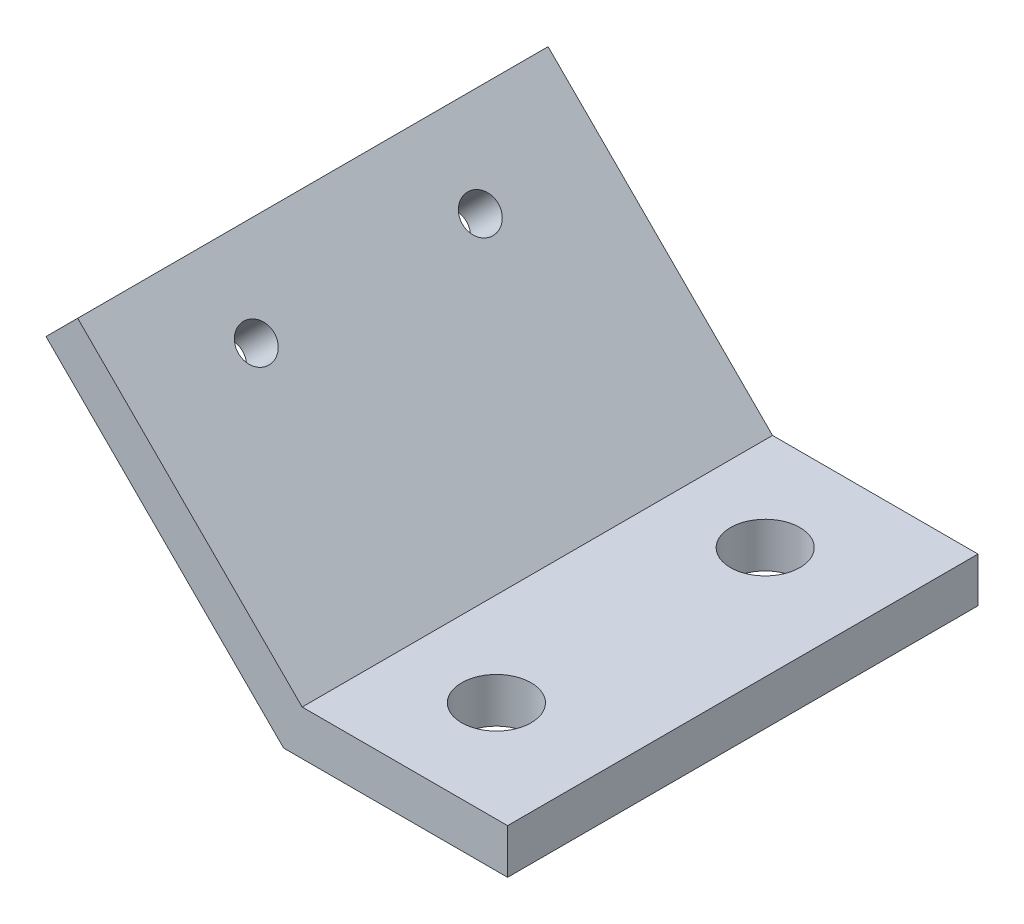
ISO-10303-21;
HEADER;
FILE_DESCRIPTION(('STEP AP214'),'2;1');
FILE_NAME('part.step','',(''),(''),'','','');
FILE_SCHEMA(('AUTOMOTIVE_DESIGN { 1 0 10303 214 1 1 1 1 }'));
ENDSEC;
DATA;
#1=APPLICATION_CONTEXT('core data for automotive mechanical design processes');
#2=APPLICATION_PROTOCOL_DEFINITION('international standard','automotive_design',2000,#1);
#3=PRODUCT_CONTEXT('',#1,'mechanical');
#4=PRODUCT('Part','Part','',(#3));
#5=PRODUCT_RELATED_PRODUCT_CATEGORY('part','',(#4));
#6=PRODUCT_DEFINITION_FORMATION('','',#4);
#7=PRODUCT_DEFINITION_CONTEXT('part definition',#1,'design');
#8=PRODUCT_DEFINITION('design','',#6,#7);
#9=PRODUCT_DEFINITION_SHAPE('','',#8);
#10=(LENGTH_UNIT() NAMED_UNIT(*) SI_UNIT(.MILLI.,.METRE.));
#11=(NAMED_UNIT(*) PLANE_ANGLE_UNIT() SI_UNIT($,.RADIAN.));
#12=(NAMED_UNIT(*) SI_UNIT($,.STERADIAN.) SOLID_ANGLE_UNIT());
#13=UNCERTAINTY_MEASURE_WITH_UNIT(LENGTH_MEASURE(1.E-05),#10,'distance_accuracy_value','');
#14=(GEOMETRIC_REPRESENTATION_CONTEXT(3) GLOBAL_UNCERTAINTY_ASSIGNED_CONTEXT((#13)) GLOBAL_UNIT_ASSIGNED_CONTEXT((#10,
#11,#12)) REPRESENTATION_CONTEXT('',''));
#15=CARTESIAN_POINT('',(0.,0.,0.));
#16=DIRECTION('',(0.,0.,1.));
#17=DIRECTION('',(1.,0.,0.));
#18=AXIS2_PLACEMENT_3D('',#15,#16,#17);
#19=CARTESIAN_POINT('',(-46.2281728654274,-2.48301663869148,42.));
#20=DIRECTION('',(-0.707106781186555,-0.70710678118654,0.));
#21=DIRECTION('',(0.70710678118654,-0.707106781186555,0.));
#22=AXIS2_PLACEMENT_3D('',#19,#20,#21);
#23=PLANE('',#22);
#24=CARTESIAN_POINT('',(-41.2784253971217,-7.43276410699737,11.));
#25=DIRECTION('',(-0.707106781186555,-0.70710678118654,0.));
#26=DIRECTION('',(0.70710678118654,-0.707106781186555,0.));
#27=AXIS2_PLACEMENT_3D('',#24,#25,#26);
#28=CIRCLE('',#27,1.6);
#29=CARTESIAN_POINT('',(-40.1470545472232,-8.56413495689586,11.));
#30=VERTEX_POINT('',#29);
#31=EDGE_CURVE('E147',#30,#30,#28,.T.);
#32=ORIENTED_EDGE('',*,*,#31,.T.);
#33=EDGE_LOOP('',(#32));
#34=FACE_BOUND('',#33,.T.);
#35=CARTESIAN_POINT('',(-41.2784253971217,-7.43276410699737,31.));
#36=DIRECTION('',(-0.707106781186555,-0.70710678118654,0.));
#37=DIRECTION('',(0.70710678118654,-0.707106781186555,0.));
#38=AXIS2_PLACEMENT_3D('',#35,#36,#37);
#39=CIRCLE('',#38,1.6);
#40=CARTESIAN_POINT('',(-40.1470545472232,-8.56413495689586,31.));
#41=VERTEX_POINT('',#40);
#42=EDGE_CURVE('E175',#41,#41,#39,.T.);
#43=ORIENTED_EDGE('',*,*,#42,.T.);
#44=EDGE_LOOP('',(#43));
#45=FACE_BOUND('',#44,.T.);
#46=DIRECTION('',(-0.70710678118654,0.707106781186555,0.));
#47=VECTOR('',#46,1.);
#48=CARTESIAN_POINT('',(-46.2281728654274,-2.48301663869148,0.));
#49=LINE('',#48,#47);
#50=CARTESIAN_POINT('',(-26.1865423050851,-22.5246471990343,0.));
#51=VERTEX_POINT('',#50);
#52=CARTESIAN_POINT('',(-46.2281728654274,-2.48301663869148,0.));
#53=VERTEX_POINT('',#52);
#54=EDGE_CURVE('E142',#51,#53,#49,.T.);
#55=ORIENTED_EDGE('',*,*,#54,.T.);
#56=DIRECTION('',(0.,0.,-1.));
#57=VECTOR('',#56,1.);
#58=CARTESIAN_POINT('',(-46.2281728654274,-2.48301663869148,42.));
#59=LINE('',#58,#57);
#60=CARTESIAN_POINT('',(-46.2281728654274,-2.48301663869148,42.));
#61=VERTEX_POINT('',#60);
#62=EDGE_CURVE('E12',#61,#53,#59,.T.);
#63=ORIENTED_EDGE('',*,*,#62,.F.);
#64=DIRECTION('',(-0.70710678118654,0.707106781186555,0.));
#65=VECTOR('',#64,1.);
#66=CARTESIAN_POINT('',(-46.2281728654274,-2.48301663869148,42.));
#67=LINE('',#66,#65);
#68=CARTESIAN_POINT('',(-26.1865423050851,-22.5246471990343,42.));
#69=VERTEX_POINT('',#68);
#70=EDGE_CURVE('E157',#69,#61,#67,.T.);
#71=ORIENTED_EDGE('',*,*,#70,.F.);
#72=DIRECTION('',(0.,0.,-1.));
#73=VECTOR('',#72,1.);
#74=CARTESIAN_POINT('',(-26.1865423050851,-22.5246471990343,42.));
#75=LINE('',#74,#73);
#76=EDGE_CURVE('E140',#69,#51,#75,.T.);
#77=ORIENTED_EDGE('',*,*,#76,.T.);
#78=EDGE_LOOP('',(#55,#63,#71,#77));
#79=FACE_BOUND('',#78,.T.);
#80=ADVANCED_FACE('F47',(#34,#45,#79),#23,.F.);
#81=CARTESIAN_POINT('',(-49.0565999901736,-5.31144376343768,42.));
#82=DIRECTION('',(0.70710678118655,-0.707106781186545,0.));
#83=DIRECTION('',(0.707106781186545,0.70710678118655,0.));
#84=AXIS2_PLACEMENT_3D('',#81,#82,#83);
#85=PLANE('',#84);
#86=DIRECTION('',(-0.707106781186545,-0.70710678118655,0.));
#87=VECTOR('',#86,1.);
#88=CARTESIAN_POINT('',(-49.0565999901736,-5.31144376343768,0.));
#89=LINE('',#88,#87);
#90=CARTESIAN_POINT('',(-49.0565999901736,-5.31144376343768,0.));
#91=VERTEX_POINT('',#90);
#92=EDGE_CURVE('E143',#53,#91,#89,.T.);
#93=ORIENTED_EDGE('',*,*,#92,.T.);
#94=DIRECTION('',(0.,0.,-1.));
#95=VECTOR('',#94,1.);
#96=CARTESIAN_POINT('',(-49.0565999901736,-5.31144376343768,42.));
#97=LINE('',#96,#95);
#98=CARTESIAN_POINT('',(-49.0565999901736,-5.31144376343768,42.));
#99=VERTEX_POINT('',#98);
#100=EDGE_CURVE('E56',#99,#91,#97,.T.);
#101=ORIENTED_EDGE('',*,*,#100,.F.);
#102=DIRECTION('',(-0.707106781186545,-0.70710678118655,0.));
#103=VECTOR('',#102,1.);
#104=CARTESIAN_POINT('',(-49.0565999901736,-5.31144376343768,42.));
#105=LINE('',#104,#103);
#106=EDGE_CURVE('E102',#61,#99,#105,.T.);
#107=ORIENTED_EDGE('',*,*,#106,.F.);
#108=ORIENTED_EDGE('',*,*,#62,.T.);
#109=EDGE_LOOP('',(#93,#101,#107,#108));
#110=FACE_BOUND('',#109,.T.);
#111=ADVANCED_FACE('F222',(#110),#85,.F.);
#112=CARTESIAN_POINT('',(-27.8433965545771,-26.5246471990341,42.));
#113=DIRECTION('',(0.707106781186546,0.707106781186549,0.));
#114=DIRECTION('',(-0.707106781186549,0.707106781186546,0.));
#115=AXIS2_PLACEMENT_3D('',#112,#113,#114);
#116=PLANE('',#115);
#117=CARTESIAN_POINT('',(-44.1068525218678,-10.2611912317435,11.));
#118=DIRECTION('',(0.707106781186546,0.707106781186549,0.));
#119=DIRECTION('',(-0.707106781186549,0.707106781186546,0.));
#120=AXIS2_PLACEMENT_3D('',#117,#118,#119);
#121=CIRCLE('',#120,1.6);
#122=CARTESIAN_POINT('',(-45.2382233717663,-9.12982038184502,11.));
#123=VERTEX_POINT('',#122);
#124=EDGE_CURVE('E173',#123,#123,#121,.T.);
#125=ORIENTED_EDGE('',*,*,#124,.T.);
#126=EDGE_LOOP('',(#125));
#127=FACE_BOUND('',#126,.T.);
#128=CARTESIAN_POINT('',(-44.1068525218678,-10.2611912317435,31.));
#129=DIRECTION('',(0.707106781186546,0.707106781186549,0.));
#130=DIRECTION('',(-0.707106781186549,0.707106781186546,0.));
#131=AXIS2_PLACEMENT_3D('',#128,#129,#130);
#132=CIRCLE('',#131,1.6);
#133=CARTESIAN_POINT('',(-45.2382233717663,-9.12982038184502,31.));
#134=VERTEX_POINT('',#133);
#135=EDGE_CURVE('E166',#134,#134,#132,.T.);
#136=ORIENTED_EDGE('',*,*,#135,.T.);
#137=EDGE_LOOP('',(#136));
#138=FACE_BOUND('',#137,.T.);
#139=DIRECTION('',(0.707106781186549,-0.707106781186546,0.));
#140=VECTOR('',#139,1.);
#141=CARTESIAN_POINT('',(-27.8433965545771,-26.5246471990341,0.));
#142=LINE('',#141,#140);
#143=CARTESIAN_POINT('',(-27.8433965545771,-26.5246471990341,0.));
#144=VERTEX_POINT('',#143);
#145=EDGE_CURVE('E146',#91,#144,#142,.T.);
#146=ORIENTED_EDGE('',*,*,#145,.T.);
#147=DIRECTION('',(0.,0.,-1.));
#148=VECTOR('',#147,1.);
#149=CARTESIAN_POINT('',(-27.8433965545771,-26.5246471990341,42.));
#150=LINE('',#149,#148);
#151=CARTESIAN_POINT('',(-27.8433965545771,-26.5246471990341,42.));
#152=VERTEX_POINT('',#151);
#153=EDGE_CURVE('E126',#152,#144,#150,.T.);
#154=ORIENTED_EDGE('',*,*,#153,.F.);
#155=DIRECTION('',(0.707106781186549,-0.707106781186546,0.));
#156=VECTOR('',#155,1.);
#157=CARTESIAN_POINT('',(-27.8433965545771,-26.5246471990341,42.));
#158=LINE('',#157,#156);
#159=EDGE_CURVE('E117',#99,#152,#158,.T.);
#160=ORIENTED_EDGE('',*,*,#159,.F.);
#161=ORIENTED_EDGE('',*,*,#100,.T.);
#162=EDGE_LOOP('',(#146,#154,#160,#161));
#163=FACE_BOUND('',#162,.T.);
#164=ADVANCED_FACE('F228',(#127,#138,#163),#116,.F.);
#165=CARTESIAN_POINT('',(-7.84339655457714,-26.5246471990341,42.));
#166=DIRECTION('',(0.,1.,0.));
#167=DIRECTION('',(-1.,0.,0.));
#168=AXIS2_PLACEMENT_3D('',#165,#166,#167);
#169=PLANE('',#168);
#170=CARTESIAN_POINT('',(-17.8433965545772,-26.5246471990341,33.));
#171=DIRECTION('',(0.,-1.,0.));
#172=DIRECTION('',(1.,0.,0.));
#173=AXIS2_PLACEMENT_3D('',#170,#171,#172);
#174=CIRCLE('',#173,3.1);
#175=CARTESIAN_POINT('',(-14.7433965545772,-26.5246471990341,33.));
#176=VERTEX_POINT('',#175);
#177=EDGE_CURVE('E177',#176,#176,#174,.T.);
#178=ORIENTED_EDGE('',*,*,#177,.F.);
#179=EDGE_LOOP('',(#178));
#180=FACE_BOUND('',#179,.T.);
#181=CARTESIAN_POINT('',(-17.8433965545772,-26.5246471990341,9.));
#182=DIRECTION('',(0.,-1.,0.));
#183=DIRECTION('',(1.,0.,0.));
#184=AXIS2_PLACEMENT_3D('',#181,#182,#183);
#185=CIRCLE('',#184,3.1);
#186=CARTESIAN_POINT('',(-14.7433965545772,-26.5246471990341,9.));
#187=VERTEX_POINT('',#186);
#188=EDGE_CURVE('E190',#187,#187,#185,.T.);
#189=ORIENTED_EDGE('',*,*,#188,.F.);
#190=EDGE_LOOP('',(#189));
#191=FACE_BOUND('',#190,.T.);
#192=DIRECTION('',(1.,0.,0.));
#193=VECTOR('',#192,1.);
#194=CARTESIAN_POINT('',(-7.84339655457714,-26.5246471990341,0.));
#195=LINE('',#194,#193);
#196=CARTESIAN_POINT('',(-7.84339655457714,-26.5246471990341,0.));
#197=VERTEX_POINT('',#196);
#198=EDGE_CURVE('E130',#144,#197,#195,.T.);
#199=ORIENTED_EDGE('',*,*,#198,.T.);
#200=DIRECTION('',(0.,0.,-1.));
#201=VECTOR('',#200,1.);
#202=CARTESIAN_POINT('',(-7.84339655457714,-26.5246471990341,42.));
#203=LINE('',#202,#201);
#204=CARTESIAN_POINT('',(-7.84339655457714,-26.5246471990341,42.));
#205=VERTEX_POINT('',#204);
#206=EDGE_CURVE('E121',#205,#197,#203,.T.);
#207=ORIENTED_EDGE('',*,*,#206,.F.);
#208=DIRECTION('',(1.,0.,0.));
#209=VECTOR('',#208,1.);
#210=CARTESIAN_POINT('',(-7.84339655457714,-26.5246471990341,42.));
#211=LINE('',#210,#209);
#212=EDGE_CURVE('E115',#152,#205,#211,.T.);
#213=ORIENTED_EDGE('',*,*,#212,.F.);
#214=ORIENTED_EDGE('',*,*,#153,.T.);
#215=EDGE_LOOP('',(#199,#207,#213,#214));
#216=FACE_BOUND('',#215,.T.);
#217=ADVANCED_FACE('F123',(#180,#191,#216),#169,.F.);
#218=CARTESIAN_POINT('',(-7.84339655457715,-22.5246471990341,42.));
#219=DIRECTION('',(-1.,0.,0.));
#220=DIRECTION('',(0.,-1.,0.));
#221=AXIS2_PLACEMENT_3D('',#218,#219,#220);
#222=PLANE('',#221);
#223=DIRECTION('',(0.,1.,0.));
#224=VECTOR('',#223,1.);
#225=CARTESIAN_POINT('',(-7.84339655457715,-22.5246471990341,0.));
#226=LINE('',#225,#224);
#227=CARTESIAN_POINT('',(-7.84339655457715,-22.5246471990341,0.));
#228=VERTEX_POINT('',#227);
#229=EDGE_CURVE('E91',#197,#228,#226,.T.);
#230=ORIENTED_EDGE('',*,*,#229,.T.);
#231=DIRECTION('',(0.,0.,-1.));
#232=VECTOR('',#231,1.);
#233=CARTESIAN_POINT('',(-7.84339655457715,-22.5246471990341,42.));
#234=LINE('',#233,#232);
#235=CARTESIAN_POINT('',(-7.84339655457715,-22.5246471990341,42.));
#236=VERTEX_POINT('',#235);
#237=EDGE_CURVE('E128',#236,#228,#234,.T.);
#238=ORIENTED_EDGE('',*,*,#237,.F.);
#239=DIRECTION('',(0.,1.,0.));
#240=VECTOR('',#239,1.);
#241=CARTESIAN_POINT('',(-7.84339655457715,-22.5246471990341,42.));
#242=LINE('',#241,#240);
#243=EDGE_CURVE('E116',#205,#236,#242,.T.);
#244=ORIENTED_EDGE('',*,*,#243,.F.);
#245=ORIENTED_EDGE('',*,*,#206,.T.);
#246=EDGE_LOOP('',(#230,#238,#244,#245));
#247=FACE_BOUND('',#246,.T.);
#248=ADVANCED_FACE('F134',(#247),#222,.F.);
#249=CARTESIAN_POINT('',(-26.1865423050851,-22.5246471990343,42.));
#250=DIRECTION('',(0.,-1.,0.));
#251=DIRECTION('',(1.,0.,0.));
#252=AXIS2_PLACEMENT_3D('',#249,#250,#251);
#253=PLANE('',#252);
#254=CARTESIAN_POINT('',(-17.8433965545772,-22.5246471990342,33.));
#255=DIRECTION('',(0.,-1.,0.));
#256=DIRECTION('',(1.,0.,0.));
#257=AXIS2_PLACEMENT_3D('',#254,#255,#256);
#258=CIRCLE('',#257,3.1);
#259=CARTESIAN_POINT('',(-14.7433965545772,-22.5246471990341,33.));
#260=VERTEX_POINT('',#259);
#261=EDGE_CURVE('E55',#260,#260,#258,.T.);
#262=ORIENTED_EDGE('',*,*,#261,.T.);
#263=EDGE_LOOP('',(#262));
#264=FACE_BOUND('',#263,.T.);
#265=CARTESIAN_POINT('',(-17.8433965545772,-22.5246471990342,9.));
#266=DIRECTION('',(0.,-1.,0.));
#267=DIRECTION('',(1.,0.,0.));
#268=AXIS2_PLACEMENT_3D('',#265,#266,#267);
#269=CIRCLE('',#268,3.1);
#270=CARTESIAN_POINT('',(-14.7433965545772,-22.5246471990341,9.));
#271=VERTEX_POINT('',#270);
#272=EDGE_CURVE('E176',#271,#271,#269,.T.);
#273=ORIENTED_EDGE('',*,*,#272,.T.);
#274=EDGE_LOOP('',(#273));
#275=FACE_BOUND('',#274,.T.);
#276=DIRECTION('',(-1.,0.,0.));
#277=VECTOR('',#276,1.);
#278=CARTESIAN_POINT('',(-26.1865423050851,-22.5246471990343,0.));
#279=LINE('',#278,#277);
#280=EDGE_CURVE('E97',#228,#51,#279,.T.);
#281=ORIENTED_EDGE('',*,*,#280,.T.);
#282=ORIENTED_EDGE('',*,*,#76,.F.);
#283=DIRECTION('',(-1.,0.,0.));
#284=VECTOR('',#283,1.);
#285=CARTESIAN_POINT('',(-26.1865423050851,-22.5246471990343,42.));
#286=LINE('',#285,#284);
#287=EDGE_CURVE('E67',#236,#69,#286,.T.);
#288=ORIENTED_EDGE('',*,*,#287,.F.);
#289=ORIENTED_EDGE('',*,*,#237,.T.);
#290=EDGE_LOOP('',(#281,#282,#288,#289));
#291=FACE_BOUND('',#290,.T.);
#292=ADVANCED_FACE('F233',(#264,#275,#291),#253,.F.);
#293=CARTESIAN_POINT('',(0.,0.,42.));
#294=DIRECTION('',(0.,0.,1.));
#295=DIRECTION('',(1.,0.,0.));
#296=AXIS2_PLACEMENT_3D('',#293,#294,#295);
#297=PLANE('',#296);
#298=ORIENTED_EDGE('',*,*,#70,.T.);
#299=ORIENTED_EDGE('',*,*,#106,.T.);
#300=ORIENTED_EDGE('',*,*,#159,.T.);
#301=ORIENTED_EDGE('',*,*,#212,.T.);
#302=ORIENTED_EDGE('',*,*,#243,.T.);
#303=ORIENTED_EDGE('',*,*,#287,.T.);
#304=EDGE_LOOP('',(#298,#299,#300,#301,#302,#303));
#305=FACE_BOUND('',#304,.T.);
#306=ADVANCED_FACE('F112',(#305),#297,.T.);
#307=CARTESIAN_POINT('',(0.,0.,0.));
#308=DIRECTION('',(0.,0.,1.));
#309=DIRECTION('',(1.,0.,0.));
#310=AXIS2_PLACEMENT_3D('',#307,#308,#309);
#311=PLANE('',#310);
#312=ORIENTED_EDGE('',*,*,#54,.F.);
#313=ORIENTED_EDGE('',*,*,#280,.F.);
#314=ORIENTED_EDGE('',*,*,#229,.F.);
#315=ORIENTED_EDGE('',*,*,#198,.F.);
#316=ORIENTED_EDGE('',*,*,#145,.F.);
#317=ORIENTED_EDGE('',*,*,#92,.F.);
#318=EDGE_LOOP('',(#312,#313,#314,#315,#316,#317));
#319=FACE_BOUND('',#318,.T.);
#320=ADVANCED_FACE('F230',(#319),#311,.F.);
#321=CARTESIAN_POINT('',(-22.0860372416965,11.7596240484279,31.));
#322=DIRECTION('',(-0.707106781186546,-0.707106781186549,0.));
#323=DIRECTION('',(0.707106781186549,-0.707106781186546,0.));
#324=AXIS2_PLACEMENT_3D('',#321,#322,#323);
#325=CYLINDRICAL_SURFACE('',#324,1.6);
#326=ORIENTED_EDGE('',*,*,#135,.F.);
#327=EDGE_LOOP('',(#326));
#328=FACE_BOUND('',#327,.T.);
#329=ORIENTED_EDGE('',*,*,#42,.F.);
#330=EDGE_LOOP('',(#329));
#331=FACE_BOUND('',#330,.T.);
#332=ADVANCED_FACE('F253',(#328,#331),#325,.F.);
#333=CARTESIAN_POINT('',(-22.0860372416965,11.7596240484279,11.));
#334=DIRECTION('',(-0.707106781186546,-0.707106781186549,0.));
#335=DIRECTION('',(0.707106781186549,-0.707106781186546,0.));
#336=AXIS2_PLACEMENT_3D('',#333,#334,#335);
#337=CYLINDRICAL_SURFACE('',#336,1.6);
#338=ORIENTED_EDGE('',*,*,#124,.F.);
#339=EDGE_LOOP('',(#338));
#340=FACE_BOUND('',#339,.T.);
#341=ORIENTED_EDGE('',*,*,#31,.F.);
#342=EDGE_LOOP('',(#341));
#343=FACE_BOUND('',#342,.T.);
#344=ADVANCED_FACE('F260',(#340,#343),#337,.F.);
#345=CARTESIAN_POINT('',(-17.8433965545772,-2.48301663869147,9.));
#346=DIRECTION('',(0.,-1.,0.));
#347=DIRECTION('',(1.,0.,0.));
#348=AXIS2_PLACEMENT_3D('',#345,#346,#347);
#349=CYLINDRICAL_SURFACE('',#348,3.1);
#350=ORIENTED_EDGE('',*,*,#188,.T.);
#351=EDGE_LOOP('',(#350));
#352=FACE_BOUND('',#351,.T.);
#353=ORIENTED_EDGE('',*,*,#272,.F.);
#354=EDGE_LOOP('',(#353));
#355=FACE_BOUND('',#354,.T.);
#356=ADVANCED_FACE('F262',(#352,#355),#349,.F.);
#357=CARTESIAN_POINT('',(-17.8433965545772,-2.48301663869147,33.));
#358=DIRECTION('',(0.,-1.,0.));
#359=DIRECTION('',(1.,0.,0.));
#360=AXIS2_PLACEMENT_3D('',#357,#358,#359);
#361=CYLINDRICAL_SURFACE('',#360,3.1);
#362=ORIENTED_EDGE('',*,*,#177,.T.);
#363=EDGE_LOOP('',(#362));
#364=FACE_BOUND('',#363,.T.);
#365=ORIENTED_EDGE('',*,*,#261,.F.);
#366=EDGE_LOOP('',(#365));
#367=FACE_BOUND('',#366,.T.);
#368=ADVANCED_FACE('F268',(#364,#367),#361,.F.);
#369=CLOSED_SHELL('',(#80,#111,#164,#217,#248,#292,#306,#320,#332,#344,#356,#368));
#370=MANIFOLD_SOLID_BREP('B2',#369);
#371=ADVANCED_BREP_SHAPE_REPRESENTATION('',(#18,#370),#14);
#372=SHAPE_DEFINITION_REPRESENTATION(#9,#371);
ENDSEC;
END-ISO-10303-21;
